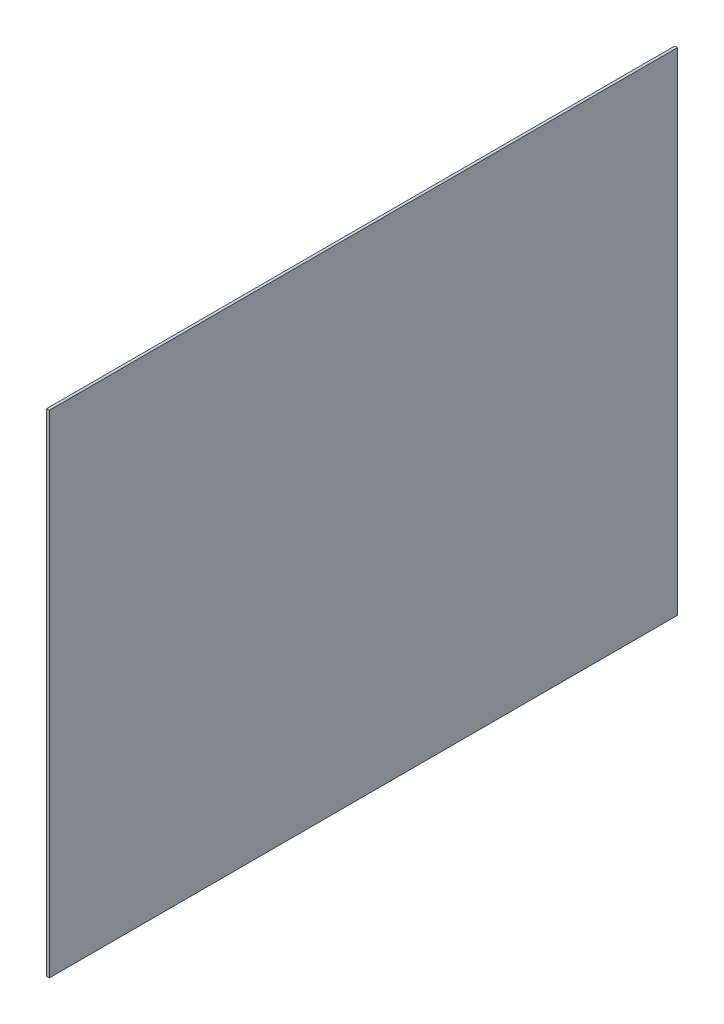
ISO-10303-21;
HEADER;
FILE_DESCRIPTION(('STEP AP214'),'2;1');
FILE_NAME('part.step','',(''),(''),'','','');
FILE_SCHEMA(('AUTOMOTIVE_DESIGN { 1 0 10303 214 1 1 1 1 }'));
ENDSEC;
DATA;
#1=APPLICATION_CONTEXT('core data for automotive mechanical design processes');
#2=APPLICATION_PROTOCOL_DEFINITION('international standard','automotive_design',2000,#1);
#3=PRODUCT_CONTEXT('',#1,'mechanical');
#4=PRODUCT('Part','Part','',(#3));
#5=PRODUCT_RELATED_PRODUCT_CATEGORY('part','',(#4));
#6=PRODUCT_DEFINITION_FORMATION('','',#4);
#7=PRODUCT_DEFINITION_CONTEXT('part definition',#1,'design');
#8=PRODUCT_DEFINITION('design','',#6,#7);
#9=PRODUCT_DEFINITION_SHAPE('','',#8);
#10=(LENGTH_UNIT() NAMED_UNIT(*) SI_UNIT(.MILLI.,.METRE.));
#11=(NAMED_UNIT(*) PLANE_ANGLE_UNIT() SI_UNIT($,.RADIAN.));
#12=(NAMED_UNIT(*) SI_UNIT($,.STERADIAN.) SOLID_ANGLE_UNIT());
#13=UNCERTAINTY_MEASURE_WITH_UNIT(LENGTH_MEASURE(1.E-05),#10,'distance_accuracy_value','');
#14=(GEOMETRIC_REPRESENTATION_CONTEXT(3) GLOBAL_UNCERTAINTY_ASSIGNED_CONTEXT((#13)) GLOBAL_UNIT_ASSIGNED_CONTEXT((#10,
#11,#12)) REPRESENTATION_CONTEXT('',''));
#15=CARTESIAN_POINT('',(0.,0.,0.));
#16=DIRECTION('',(0.,0.,1.));
#17=DIRECTION('',(1.,0.,0.));
#18=AXIS2_PLACEMENT_3D('',#15,#16,#17);
#19=CARTESIAN_POINT('',(3.,-270.,-345.));
#20=DIRECTION('',(0.,0.,1.));
#21=DIRECTION('',(1.,0.,0.));
#22=AXIS2_PLACEMENT_3D('',#19,#20,#21);
#23=PLANE('',#22);
#24=DIRECTION('',(0.,1.,0.));
#25=VECTOR('',#24,1.);
#26=CARTESIAN_POINT('',(0.,-270.,-345.));
#27=LINE('',#26,#25);
#28=CARTESIAN_POINT('',(0.,-270.,-345.));
#29=VERTEX_POINT('',#28);
#30=CARTESIAN_POINT('',(0.,270.,-345.));
#31=VERTEX_POINT('',#30);
#32=EDGE_CURVE('E96',#29,#31,#27,.T.);
#33=ORIENTED_EDGE('',*,*,#32,.T.);
#34=DIRECTION('',(-1.,0.,0.));
#35=VECTOR('',#34,1.);
#36=CARTESIAN_POINT('',(3.,270.,-345.));
#37=LINE('',#36,#35);
#38=CARTESIAN_POINT('',(3.,270.,-345.));
#39=VERTEX_POINT('',#38);
#40=EDGE_CURVE('E11',#39,#31,#37,.T.);
#41=ORIENTED_EDGE('',*,*,#40,.F.);
#42=DIRECTION('',(0.,1.,0.));
#43=VECTOR('',#42,1.);
#44=CARTESIAN_POINT('',(3.,-270.,-345.));
#45=LINE('',#44,#43);
#46=CARTESIAN_POINT('',(3.,-270.,-345.));
#47=VERTEX_POINT('',#46);
#48=EDGE_CURVE('E84',#47,#39,#45,.T.);
#49=ORIENTED_EDGE('',*,*,#48,.F.);
#50=DIRECTION('',(-1.,0.,0.));
#51=VECTOR('',#50,1.);
#52=CARTESIAN_POINT('',(3.,-270.,-345.));
#53=LINE('',#52,#51);
#54=EDGE_CURVE('E92',#47,#29,#53,.T.);
#55=ORIENTED_EDGE('',*,*,#54,.T.);
#56=EDGE_LOOP('',(#33,#41,#49,#55));
#57=FACE_BOUND('',#56,.T.);
#58=ADVANCED_FACE('F33',(#57),#23,.F.);
#59=CARTESIAN_POINT('',(3.,270.,345.));
#60=DIRECTION('',(0.,-1.,0.));
#61=DIRECTION('',(0.,0.,-1.));
#62=AXIS2_PLACEMENT_3D('',#59,#60,#61);
#63=PLANE('',#62);
#64=DIRECTION('',(0.,0.,1.));
#65=VECTOR('',#64,1.);
#66=CARTESIAN_POINT('',(0.,270.,345.));
#67=LINE('',#66,#65);
#68=CARTESIAN_POINT('',(0.,270.,345.));
#69=VERTEX_POINT('',#68);
#70=EDGE_CURVE('E88',#31,#69,#67,.T.);
#71=ORIENTED_EDGE('',*,*,#70,.T.);
#72=DIRECTION('',(-1.,0.,0.));
#73=VECTOR('',#72,1.);
#74=CARTESIAN_POINT('',(3.,270.,345.));
#75=LINE('',#74,#73);
#76=CARTESIAN_POINT('',(3.,270.,345.));
#77=VERTEX_POINT('',#76);
#78=EDGE_CURVE('E41',#77,#69,#75,.T.);
#79=ORIENTED_EDGE('',*,*,#78,.F.);
#80=DIRECTION('',(0.,0.,1.));
#81=VECTOR('',#80,1.);
#82=CARTESIAN_POINT('',(3.,270.,345.));
#83=LINE('',#82,#81);
#84=EDGE_CURVE('E79',#39,#77,#83,.T.);
#85=ORIENTED_EDGE('',*,*,#84,.F.);
#86=ORIENTED_EDGE('',*,*,#40,.T.);
#87=EDGE_LOOP('',(#71,#79,#85,#86));
#88=FACE_BOUND('',#87,.T.);
#89=ADVANCED_FACE('F87',(#88),#63,.F.);
#90=CARTESIAN_POINT('',(3.,-270.,345.));
#91=DIRECTION('',(0.,0.,-1.));
#92=DIRECTION('',(-1.,0.,0.));
#93=AXIS2_PLACEMENT_3D('',#90,#91,#92);
#94=PLANE('',#93);
#95=DIRECTION('',(0.,-1.,0.));
#96=VECTOR('',#95,1.);
#97=CARTESIAN_POINT('',(0.,-270.,345.));
#98=LINE('',#97,#96);
#99=CARTESIAN_POINT('',(0.,-270.,345.));
#100=VERTEX_POINT('',#99);
#101=EDGE_CURVE('E66',#69,#100,#98,.T.);
#102=ORIENTED_EDGE('',*,*,#101,.T.);
#103=DIRECTION('',(-1.,0.,0.));
#104=VECTOR('',#103,1.);
#105=CARTESIAN_POINT('',(3.,-270.,345.));
#106=LINE('',#105,#104);
#107=CARTESIAN_POINT('',(3.,-270.,345.));
#108=VERTEX_POINT('',#107);
#109=EDGE_CURVE('E89',#108,#100,#106,.T.);
#110=ORIENTED_EDGE('',*,*,#109,.F.);
#111=DIRECTION('',(0.,-1.,0.));
#112=VECTOR('',#111,1.);
#113=CARTESIAN_POINT('',(3.,-270.,345.));
#114=LINE('',#113,#112);
#115=EDGE_CURVE('E82',#77,#108,#114,.T.);
#116=ORIENTED_EDGE('',*,*,#115,.F.);
#117=ORIENTED_EDGE('',*,*,#78,.T.);
#118=EDGE_LOOP('',(#102,#110,#116,#117));
#119=FACE_BOUND('',#118,.T.);
#120=ADVANCED_FACE('F90',(#119),#94,.F.);
#121=CARTESIAN_POINT('',(3.,-270.,345.));
#122=DIRECTION('',(0.,1.,0.));
#123=DIRECTION('',(0.,0.,1.));
#124=AXIS2_PLACEMENT_3D('',#121,#122,#123);
#125=PLANE('',#124);
#126=DIRECTION('',(0.,0.,-1.));
#127=VECTOR('',#126,1.);
#128=CARTESIAN_POINT('',(0.,-270.,345.));
#129=LINE('',#128,#127);
#130=EDGE_CURVE('E72',#100,#29,#129,.T.);
#131=ORIENTED_EDGE('',*,*,#130,.T.);
#132=ORIENTED_EDGE('',*,*,#54,.F.);
#133=DIRECTION('',(0.,0.,-1.));
#134=VECTOR('',#133,1.);
#135=CARTESIAN_POINT('',(3.,-270.,345.));
#136=LINE('',#135,#134);
#137=EDGE_CURVE('E49',#108,#47,#136,.T.);
#138=ORIENTED_EDGE('',*,*,#137,.F.);
#139=ORIENTED_EDGE('',*,*,#109,.T.);
#140=EDGE_LOOP('',(#131,#132,#138,#139));
#141=FACE_BOUND('',#140,.T.);
#142=ADVANCED_FACE('F103',(#141),#125,.F.);
#143=CARTESIAN_POINT('',(3.,0.,0.));
#144=DIRECTION('',(-1.,0.,0.));
#145=DIRECTION('',(0.,0.,1.));
#146=AXIS2_PLACEMENT_3D('',#143,#144,#145);
#147=PLANE('',#146);
#148=ORIENTED_EDGE('',*,*,#48,.T.);
#149=ORIENTED_EDGE('',*,*,#84,.T.);
#150=ORIENTED_EDGE('',*,*,#115,.T.);
#151=ORIENTED_EDGE('',*,*,#137,.T.);
#152=EDGE_LOOP('',(#148,#149,#150,#151));
#153=FACE_BOUND('',#152,.T.);
#154=ADVANCED_FACE('F80',(#153),#147,.F.);
#155=CARTESIAN_POINT('',(0.,0.,0.));
#156=DIRECTION('',(-1.,0.,0.));
#157=DIRECTION('',(0.,0.,1.));
#158=AXIS2_PLACEMENT_3D('',#155,#156,#157);
#159=PLANE('',#158);
#160=ORIENTED_EDGE('',*,*,#32,.F.);
#161=ORIENTED_EDGE('',*,*,#130,.F.);
#162=ORIENTED_EDGE('',*,*,#101,.F.);
#163=ORIENTED_EDGE('',*,*,#70,.F.);
#164=EDGE_LOOP('',(#160,#161,#162,#163));
#165=FACE_BOUND('',#164,.T.);
#166=ADVANCED_FACE('F106',(#165),#159,.T.);
#167=CLOSED_SHELL('',(#58,#89,#120,#142,#154,#166));
#168=MANIFOLD_SOLID_BREP('B2',#167);
#169=ADVANCED_BREP_SHAPE_REPRESENTATION('',(#18,#168),#14);
#170=SHAPE_DEFINITION_REPRESENTATION(#9,#169);
ENDSEC;
END-ISO-10303-21;
